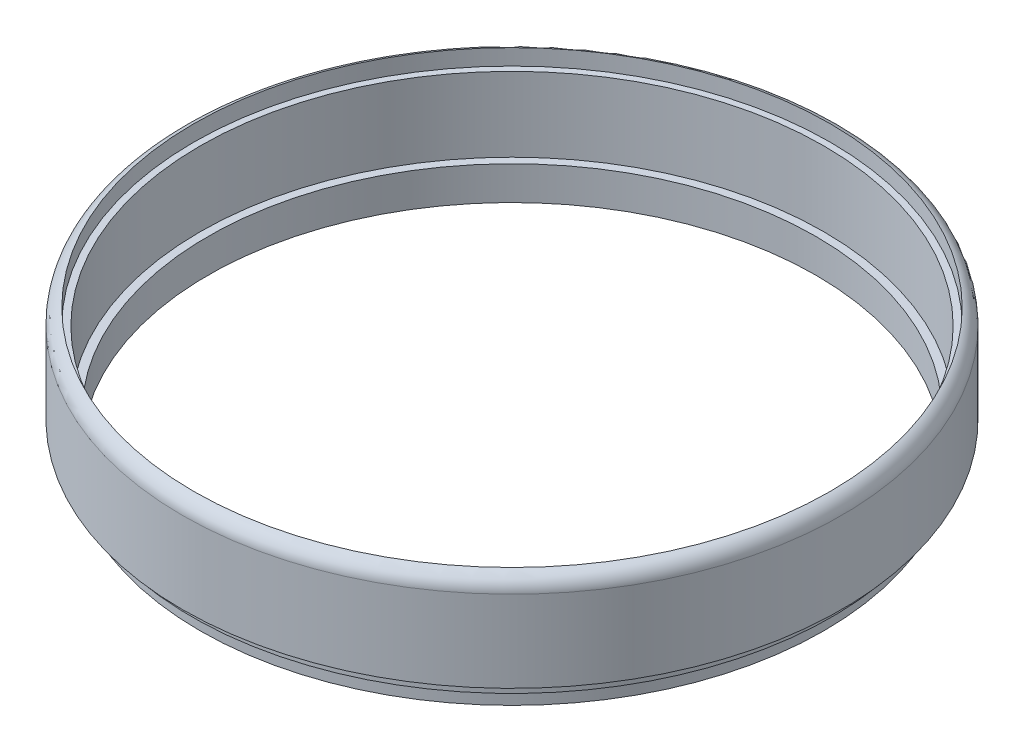
ISO-10303-21;
HEADER;
FILE_DESCRIPTION(('STEP AP214'),'2;1');
FILE_NAME('part.step','',(''),(''),'','','');
FILE_SCHEMA(('AUTOMOTIVE_DESIGN { 1 0 10303 214 1 1 1 1 }'));
ENDSEC;
DATA;
#1=APPLICATION_CONTEXT('core data for automotive mechanical design processes');
#2=APPLICATION_PROTOCOL_DEFINITION('international standard','automotive_design',2000,#1);
#3=PRODUCT_CONTEXT('',#1,'mechanical');
#4=PRODUCT('Part','Part','',(#3));
#5=PRODUCT_RELATED_PRODUCT_CATEGORY('part','',(#4));
#6=PRODUCT_DEFINITION_FORMATION('','',#4);
#7=PRODUCT_DEFINITION_CONTEXT('part definition',#1,'design');
#8=PRODUCT_DEFINITION('design','',#6,#7);
#9=PRODUCT_DEFINITION_SHAPE('','',#8);
#10=(LENGTH_UNIT() NAMED_UNIT(*) SI_UNIT(.MILLI.,.METRE.));
#11=(NAMED_UNIT(*) PLANE_ANGLE_UNIT() SI_UNIT($,.RADIAN.));
#12=(NAMED_UNIT(*) SI_UNIT($,.STERADIAN.) SOLID_ANGLE_UNIT());
#13=UNCERTAINTY_MEASURE_WITH_UNIT(LENGTH_MEASURE(1.E-05),#10,'distance_accuracy_value','');
#14=(GEOMETRIC_REPRESENTATION_CONTEXT(3) GLOBAL_UNCERTAINTY_ASSIGNED_CONTEXT((#13)) GLOBAL_UNIT_ASSIGNED_CONTEXT((#10,
#11,#12)) REPRESENTATION_CONTEXT('',''));
#15=CARTESIAN_POINT('',(0.,0.,0.));
#16=DIRECTION('',(0.,0.,1.));
#17=DIRECTION('',(1.,0.,0.));
#18=AXIS2_PLACEMENT_3D('',#15,#16,#17);
#19=CARTESIAN_POINT('',(19.,0.,0.));
#20=DIRECTION('',(0.,-1.,0.));
#21=DIRECTION('',(0.,0.,-1.));
#22=AXIS2_PLACEMENT_3D('',#19,#20,#21);
#23=PLANE('',#22);
#24=CARTESIAN_POINT('',(0.,0.,0.));
#25=DIRECTION('',(0.,-1.,0.));
#26=DIRECTION('',(0.,0.,-1.));
#27=AXIS2_PLACEMENT_3D('',#24,#25,#26);
#28=CIRCLE('',#27,19.5);
#29=CARTESIAN_POINT('',(0.,0.,-19.5));
#30=VERTEX_POINT('',#29);
#31=EDGE_CURVE('E46',#30,#30,#28,.T.);
#32=ORIENTED_EDGE('',*,*,#31,.T.);
#33=EDGE_LOOP('',(#32));
#34=FACE_BOUND('',#33,.T.);
#35=CARTESIAN_POINT('',(0.,0.,0.));
#36=DIRECTION('',(0.,-1.,0.));
#37=DIRECTION('',(0.,0.,-1.));
#38=AXIS2_PLACEMENT_3D('',#35,#36,#37);
#39=CIRCLE('',#38,19.);
#40=CARTESIAN_POINT('',(0.,0.,-19.));
#41=VERTEX_POINT('',#40);
#42=EDGE_CURVE('E80',#41,#41,#39,.T.);
#43=ORIENTED_EDGE('',*,*,#42,.F.);
#44=EDGE_LOOP('',(#43));
#45=FACE_BOUND('',#44,.T.);
#46=ADVANCED_FACE('F39',(#34,#45),#23,.T.);
#47=CARTESIAN_POINT('',(0.,0.,0.));
#48=DIRECTION('',(0.,-1.,0.));
#49=DIRECTION('',(0.,0.,-1.));
#50=AXIS2_PLACEMENT_3D('',#47,#48,#49);
#51=CYLINDRICAL_SURFACE('',#50,19.5);
#52=CARTESIAN_POINT('',(0.,1.,0.));
#53=DIRECTION('',(0.,-1.,0.));
#54=DIRECTION('',(0.,0.,-1.));
#55=AXIS2_PLACEMENT_3D('',#52,#53,#54);
#56=CIRCLE('',#55,19.5);
#57=CARTESIAN_POINT('',(0.,1.,-19.5));
#58=VERTEX_POINT('',#57);
#59=EDGE_CURVE('E50',#58,#58,#56,.T.);
#60=ORIENTED_EDGE('',*,*,#59,.T.);
#61=EDGE_LOOP('',(#60));
#62=FACE_BOUND('',#61,.T.);
#63=ORIENTED_EDGE('',*,*,#31,.F.);
#64=EDGE_LOOP('',(#63));
#65=FACE_BOUND('',#64,.T.);
#66=ADVANCED_FACE('F88',(#62,#65),#51,.T.);
#67=CARTESIAN_POINT('',(19.5,1.,0.));
#68=DIRECTION('',(0.,-1.,0.));
#69=DIRECTION('',(0.,0.,-1.));
#70=AXIS2_PLACEMENT_3D('',#67,#68,#69);
#71=PLANE('',#70);
#72=CARTESIAN_POINT('',(0.,1.,0.));
#73=DIRECTION('',(0.,-1.,0.));
#74=DIRECTION('',(0.,0.,-1.));
#75=AXIS2_PLACEMENT_3D('',#72,#73,#74);
#76=CIRCLE('',#75,20.);
#77=CARTESIAN_POINT('',(0.,1.,-20.));
#78=VERTEX_POINT('',#77);
#79=EDGE_CURVE('E54',#78,#78,#76,.T.);
#80=ORIENTED_EDGE('',*,*,#79,.T.);
#81=EDGE_LOOP('',(#80));
#82=FACE_BOUND('',#81,.T.);
#83=ORIENTED_EDGE('',*,*,#59,.F.);
#84=EDGE_LOOP('',(#83));
#85=FACE_BOUND('',#84,.T.);
#86=ADVANCED_FACE('F92',(#82,#85),#71,.T.);
#87=CARTESIAN_POINT('',(0.,0.,0.));
#88=DIRECTION('',(0.,-1.,0.));
#89=DIRECTION('',(0.,0.,-1.));
#90=AXIS2_PLACEMENT_3D('',#87,#88,#89);
#91=CYLINDRICAL_SURFACE('',#90,20.);
#92=CARTESIAN_POINT('',(0.,1.7,0.));
#93=DIRECTION('',(0.,-1.,0.));
#94=DIRECTION('',(0.,0.,-1.));
#95=AXIS2_PLACEMENT_3D('',#92,#93,#94);
#96=CIRCLE('',#95,20.);
#97=CARTESIAN_POINT('',(0.,1.7,-20.));
#98=VERTEX_POINT('',#97);
#99=EDGE_CURVE('E59',#98,#98,#96,.T.);
#100=ORIENTED_EDGE('',*,*,#99,.T.);
#101=EDGE_LOOP('',(#100));
#102=FACE_BOUND('',#101,.T.);
#103=ORIENTED_EDGE('',*,*,#79,.F.);
#104=EDGE_LOOP('',(#103));
#105=FACE_BOUND('',#104,.T.);
#106=ADVANCED_FACE('F98',(#102,#105),#91,.T.);
#107=CARTESIAN_POINT('',(20.,1.7,0.));
#108=DIRECTION('',(0.,-1.,0.));
#109=DIRECTION('',(0.,0.,-1.));
#110=AXIS2_PLACEMENT_3D('',#107,#108,#109);
#111=PLANE('',#110);
#112=CARTESIAN_POINT('',(0.,1.7,0.));
#113=DIRECTION('',(0.,-1.,0.));
#114=DIRECTION('',(0.,0.,-1.));
#115=AXIS2_PLACEMENT_3D('',#112,#113,#114);
#116=CIRCLE('',#115,20.6);
#117=CARTESIAN_POINT('',(0.,1.7,-20.6));
#118=VERTEX_POINT('',#117);
#119=EDGE_CURVE('E62',#118,#118,#116,.T.);
#120=ORIENTED_EDGE('',*,*,#119,.T.);
#121=EDGE_LOOP('',(#120));
#122=FACE_BOUND('',#121,.T.);
#123=ORIENTED_EDGE('',*,*,#99,.F.);
#124=EDGE_LOOP('',(#123));
#125=FACE_BOUND('',#124,.T.);
#126=ADVANCED_FACE('F102',(#122,#125),#111,.T.);
#127=CARTESIAN_POINT('',(0.,0.,0.));
#128=DIRECTION('',(0.,-1.,0.));
#129=DIRECTION('',(0.,0.,-1.));
#130=AXIS2_PLACEMENT_3D('',#127,#128,#129);
#131=CYLINDRICAL_SURFACE('',#130,20.6);
#132=CARTESIAN_POINT('',(0.,6.79606079858306,0.));
#133=DIRECTION('',(0.,1.,0.));
#134=DIRECTION('',(0.,0.,1.));
#135=AXIS2_PLACEMENT_3D('',#132,#133,#134);
#136=CIRCLE('',#135,20.6);
#137=CARTESIAN_POINT('',(0.,6.79606079858306,20.6));
#138=VERTEX_POINT('',#137);
#139=EDGE_CURVE('E10',#138,#138,#136,.F.);
#140=ORIENTED_EDGE('',*,*,#139,.T.);
#141=EDGE_LOOP('',(#140));
#142=FACE_BOUND('',#141,.T.);
#143=ORIENTED_EDGE('',*,*,#119,.F.);
#144=EDGE_LOOP('',(#143));
#145=FACE_BOUND('',#144,.T.);
#146=ADVANCED_FACE('F106',(#142,#145),#131,.T.);
#147=CARTESIAN_POINT('',(0.,0.,0.));
#148=DIRECTION('',(0.,-1.,0.));
#149=DIRECTION('',(0.,0.,-1.));
#150=AXIS2_PLACEMENT_3D('',#147,#148,#149);
#151=CYLINDRICAL_SURFACE('',#150,19.9);
#152=CARTESIAN_POINT('',(0.,6.75,0.));
#153=DIRECTION('',(0.,-1.,0.));
#154=DIRECTION('',(0.,0.,-1.));
#155=AXIS2_PLACEMENT_3D('',#152,#153,#154);
#156=CIRCLE('',#155,19.9);
#157=CARTESIAN_POINT('',(0.,6.75,-19.9));
#158=VERTEX_POINT('',#157);
#159=EDGE_CURVE('E68',#158,#158,#156,.T.);
#160=ORIENTED_EDGE('',*,*,#159,.T.);
#161=EDGE_LOOP('',(#160));
#162=FACE_BOUND('',#161,.T.);
#163=CARTESIAN_POINT('',(0.,7.75,0.));
#164=DIRECTION('',(0.,-1.,0.));
#165=DIRECTION('',(0.,0.,-1.));
#166=AXIS2_PLACEMENT_3D('',#163,#164,#165);
#167=CIRCLE('',#166,19.9);
#168=CARTESIAN_POINT('',(0.,7.75,-19.9));
#169=VERTEX_POINT('',#168);
#170=EDGE_CURVE('E65',#169,#169,#167,.T.);
#171=ORIENTED_EDGE('',*,*,#170,.F.);
#172=EDGE_LOOP('',(#171));
#173=FACE_BOUND('',#172,.T.);
#174=ADVANCED_FACE('F110',(#162,#173),#151,.F.);
#175=CARTESIAN_POINT('',(19.9,6.75,0.));
#176=DIRECTION('',(0.,1.,0.));
#177=DIRECTION('',(0.,0.,1.));
#178=AXIS2_PLACEMENT_3D('',#175,#176,#177);
#179=PLANE('',#178);
#180=CARTESIAN_POINT('',(0.,6.75,0.));
#181=DIRECTION('',(0.,-1.,0.));
#182=DIRECTION('',(0.,0.,-1.));
#183=AXIS2_PLACEMENT_3D('',#180,#181,#182);
#184=CIRCLE('',#183,19.5);
#185=CARTESIAN_POINT('',(0.,6.75,-19.5));
#186=VERTEX_POINT('',#185);
#187=EDGE_CURVE('E71',#186,#186,#184,.T.);
#188=ORIENTED_EDGE('',*,*,#187,.T.);
#189=EDGE_LOOP('',(#188));
#190=FACE_BOUND('',#189,.T.);
#191=ORIENTED_EDGE('',*,*,#159,.F.);
#192=EDGE_LOOP('',(#191));
#193=FACE_BOUND('',#192,.T.);
#194=ADVANCED_FACE('F113',(#190,#193),#179,.T.);
#195=CARTESIAN_POINT('',(0.,0.,0.));
#196=DIRECTION('',(0.,-1.,0.));
#197=DIRECTION('',(0.,0.,-1.));
#198=AXIS2_PLACEMENT_3D('',#195,#196,#197);
#199=CYLINDRICAL_SURFACE('',#198,19.5);
#200=CARTESIAN_POINT('',(0.,2.1,0.));
#201=DIRECTION('',(0.,-1.,0.));
#202=DIRECTION('',(0.,0.,-1.));
#203=AXIS2_PLACEMENT_3D('',#200,#201,#202);
#204=CIRCLE('',#203,19.5);
#205=CARTESIAN_POINT('',(0.,2.1,-19.5));
#206=VERTEX_POINT('',#205);
#207=EDGE_CURVE('E74',#206,#206,#204,.T.);
#208=ORIENTED_EDGE('',*,*,#207,.T.);
#209=EDGE_LOOP('',(#208));
#210=FACE_BOUND('',#209,.T.);
#211=ORIENTED_EDGE('',*,*,#187,.F.);
#212=EDGE_LOOP('',(#211));
#213=FACE_BOUND('',#212,.T.);
#214=ADVANCED_FACE('F117',(#210,#213),#199,.F.);
#215=CARTESIAN_POINT('',(19.5,2.1,0.));
#216=DIRECTION('',(0.,1.,0.));
#217=DIRECTION('',(0.,0.,1.));
#218=AXIS2_PLACEMENT_3D('',#215,#216,#217);
#219=PLANE('',#218);
#220=CARTESIAN_POINT('',(0.,2.1,0.));
#221=DIRECTION('',(0.,-1.,0.));
#222=DIRECTION('',(0.,0.,-1.));
#223=AXIS2_PLACEMENT_3D('',#220,#221,#222);
#224=CIRCLE('',#223,19.);
#225=CARTESIAN_POINT('',(0.,2.1,-19.));
#226=VERTEX_POINT('',#225);
#227=EDGE_CURVE('E77',#226,#226,#224,.T.);
#228=ORIENTED_EDGE('',*,*,#227,.T.);
#229=EDGE_LOOP('',(#228));
#230=FACE_BOUND('',#229,.T.);
#231=ORIENTED_EDGE('',*,*,#207,.F.);
#232=EDGE_LOOP('',(#231));
#233=FACE_BOUND('',#232,.T.);
#234=ADVANCED_FACE('F121',(#230,#233),#219,.T.);
#235=CARTESIAN_POINT('',(0.,0.,0.));
#236=DIRECTION('',(0.,-1.,0.));
#237=DIRECTION('',(0.,0.,-1.));
#238=AXIS2_PLACEMENT_3D('',#235,#236,#237);
#239=CYLINDRICAL_SURFACE('',#238,19.);
#240=ORIENTED_EDGE('',*,*,#42,.T.);
#241=EDGE_LOOP('',(#240));
#242=FACE_BOUND('',#241,.T.);
#243=ORIENTED_EDGE('',*,*,#227,.F.);
#244=EDGE_LOOP('',(#243));
#245=FACE_BOUND('',#244,.T.);
#246=ADVANCED_FACE('F84',(#242,#245),#239,.F.);
#247=CARTESIAN_POINT('',(0.,6.79606079858306,0.));
#248=DIRECTION('',(0.,1.,0.));
#249=DIRECTION('',(0.,0.,1.));
#250=AXIS2_PLACEMENT_3D('',#247,#248,#249);
#251=TOROIDAL_SURFACE('',#250,19.6,1.);
#252=ORIENTED_EDGE('',*,*,#170,.T.);
#253=EDGE_LOOP('',(#252));
#254=FACE_BOUND('',#253,.T.);
#255=ORIENTED_EDGE('',*,*,#139,.F.);
#256=EDGE_LOOP('',(#255));
#257=FACE_BOUND('',#256,.T.);
#258=ADVANCED_FACE('F41',(#254,#257),#251,.T.);
#259=CLOSED_SHELL('',(#46,#66,#86,#106,#126,#146,#174,#194,#214,#234,#246,#258));
#260=MANIFOLD_SOLID_BREP('B2',#259);
#261=ADVANCED_BREP_SHAPE_REPRESENTATION('',(#18,#260),#14);
#262=SHAPE_DEFINITION_REPRESENTATION(#9,#261);
ENDSEC;
END-ISO-10303-21;
